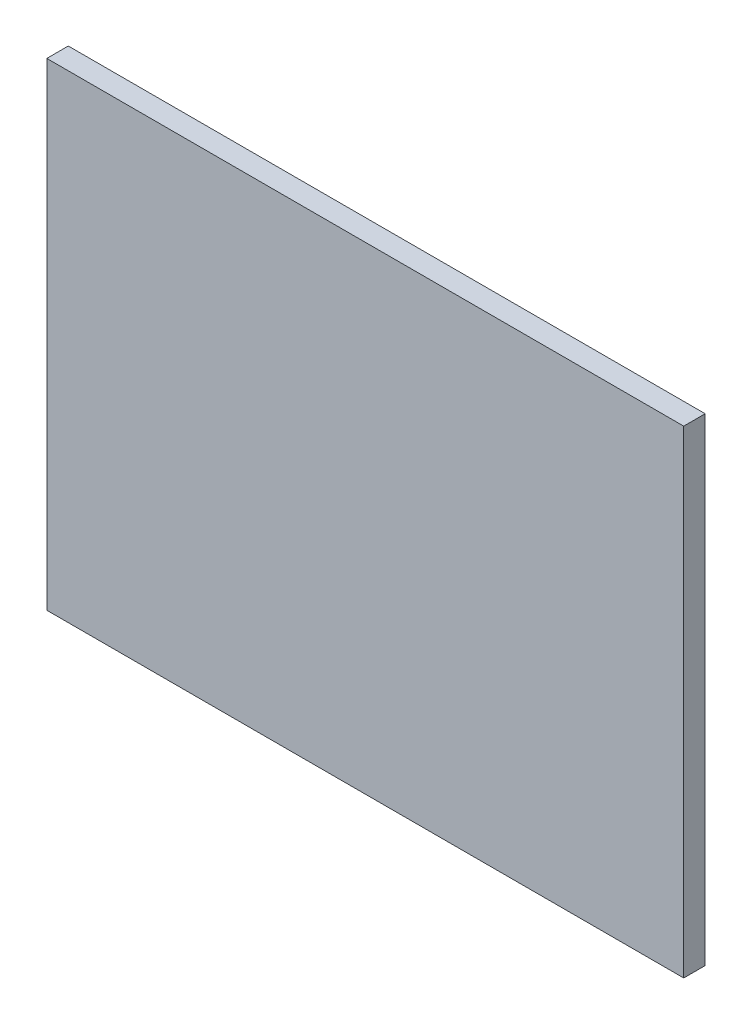
ISO-10303-21;
HEADER;
FILE_DESCRIPTION(('STEP AP214'),'2;1');
FILE_NAME('part.step','',(''),(''),'','','');
FILE_SCHEMA(('AUTOMOTIVE_DESIGN { 1 0 10303 214 1 1 1 1 }'));
ENDSEC;
DATA;
#1=APPLICATION_CONTEXT('core data for automotive mechanical design processes');
#2=APPLICATION_PROTOCOL_DEFINITION('international standard','automotive_design',2000,#1);
#3=PRODUCT_CONTEXT('',#1,'mechanical');
#4=PRODUCT('Part','Part','',(#3));
#5=PRODUCT_RELATED_PRODUCT_CATEGORY('part','',(#4));
#6=PRODUCT_DEFINITION_FORMATION('','',#4);
#7=PRODUCT_DEFINITION_CONTEXT('part definition',#1,'design');
#8=PRODUCT_DEFINITION('design','',#6,#7);
#9=PRODUCT_DEFINITION_SHAPE('','',#8);
#10=(LENGTH_UNIT() NAMED_UNIT(*) SI_UNIT(.MILLI.,.METRE.));
#11=(NAMED_UNIT(*) PLANE_ANGLE_UNIT() SI_UNIT($,.RADIAN.));
#12=(NAMED_UNIT(*) SI_UNIT($,.STERADIAN.) SOLID_ANGLE_UNIT());
#13=UNCERTAINTY_MEASURE_WITH_UNIT(LENGTH_MEASURE(1.E-05),#10,'distance_accuracy_value','');
#14=(GEOMETRIC_REPRESENTATION_CONTEXT(3) GLOBAL_UNCERTAINTY_ASSIGNED_CONTEXT((#13)) GLOBAL_UNIT_ASSIGNED_CONTEXT((#10,
#11,#12)) REPRESENTATION_CONTEXT('',''));
#15=CARTESIAN_POINT('',(0.,0.,0.));
#16=DIRECTION('',(0.,0.,1.));
#17=DIRECTION('',(1.,0.,0.));
#18=AXIS2_PLACEMENT_3D('',#15,#16,#17);
#19=CARTESIAN_POINT('',(0.,222.524852620141,10.));
#20=DIRECTION('',(1.,0.,0.));
#21=DIRECTION('',(0.,0.,-1.));
#22=AXIS2_PLACEMENT_3D('',#19,#20,#21);
#23=PLANE('',#22);
#24=DIRECTION('',(0.,-1.,0.));
#25=VECTOR('',#24,1.);
#26=CARTESIAN_POINT('',(0.,222.524852620141,0.));
#27=LINE('',#26,#25);
#28=CARTESIAN_POINT('',(0.,222.524852620141,0.));
#29=VERTEX_POINT('',#28);
#30=CARTESIAN_POINT('',(0.,0.,0.));
#31=VERTEX_POINT('',#30);
#32=EDGE_CURVE('E102',#29,#31,#27,.T.);
#33=ORIENTED_EDGE('',*,*,#32,.T.);
#34=DIRECTION('',(0.,0.,-1.));
#35=VECTOR('',#34,1.);
#36=CARTESIAN_POINT('',(0.,0.,10.));
#37=LINE('',#36,#35);
#38=CARTESIAN_POINT('',(0.,0.,10.));
#39=VERTEX_POINT('',#38);
#40=EDGE_CURVE('E11',#39,#31,#37,.T.);
#41=ORIENTED_EDGE('',*,*,#40,.F.);
#42=DIRECTION('',(0.,-1.,0.));
#43=VECTOR('',#42,1.);
#44=CARTESIAN_POINT('',(0.,222.524852620141,10.));
#45=LINE('',#44,#43);
#46=CARTESIAN_POINT('',(0.,222.524852620141,10.));
#47=VERTEX_POINT('',#46);
#48=EDGE_CURVE('E90',#47,#39,#45,.T.);
#49=ORIENTED_EDGE('',*,*,#48,.F.);
#50=DIRECTION('',(0.,0.,-1.));
#51=VECTOR('',#50,1.);
#52=CARTESIAN_POINT('',(0.,222.524852620141,10.));
#53=LINE('',#52,#51);
#54=EDGE_CURVE('E98',#47,#29,#53,.T.);
#55=ORIENTED_EDGE('',*,*,#54,.T.);
#56=EDGE_LOOP('',(#33,#41,#49,#55));
#57=FACE_BOUND('',#56,.T.);
#58=ADVANCED_FACE('F39',(#57),#23,.F.);
#59=CARTESIAN_POINT('',(0.,0.,10.));
#60=DIRECTION('',(0.,1.,0.));
#61=DIRECTION('',(0.,0.,1.));
#62=AXIS2_PLACEMENT_3D('',#59,#60,#61);
#63=PLANE('',#62);
#64=DIRECTION('',(1.,0.,0.));
#65=VECTOR('',#64,1.);
#66=CARTESIAN_POINT('',(0.,0.,0.));
#67=LINE('',#66,#65);
#68=CARTESIAN_POINT('',(296.550595169026,0.,0.));
#69=VERTEX_POINT('',#68);
#70=EDGE_CURVE('E94',#31,#69,#67,.T.);
#71=ORIENTED_EDGE('',*,*,#70,.T.);
#72=DIRECTION('',(0.,0.,-1.));
#73=VECTOR('',#72,1.);
#74=CARTESIAN_POINT('',(296.550595169026,0.,10.));
#75=LINE('',#74,#73);
#76=CARTESIAN_POINT('',(296.550595169026,0.,10.));
#77=VERTEX_POINT('',#76);
#78=EDGE_CURVE('E47',#77,#69,#75,.T.);
#79=ORIENTED_EDGE('',*,*,#78,.F.);
#80=DIRECTION('',(1.,0.,0.));
#81=VECTOR('',#80,1.);
#82=CARTESIAN_POINT('',(0.,0.,10.));
#83=LINE('',#82,#81);
#84=EDGE_CURVE('E85',#39,#77,#83,.T.);
#85=ORIENTED_EDGE('',*,*,#84,.F.);
#86=ORIENTED_EDGE('',*,*,#40,.T.);
#87=EDGE_LOOP('',(#71,#79,#85,#86));
#88=FACE_BOUND('',#87,.T.);
#89=ADVANCED_FACE('F93',(#88),#63,.F.);
#90=CARTESIAN_POINT('',(296.550595169026,222.524852620141,10.));
#91=DIRECTION('',(-1.,0.,0.));
#92=DIRECTION('',(0.,0.,1.));
#93=AXIS2_PLACEMENT_3D('',#90,#91,#92);
#94=PLANE('',#93);
#95=DIRECTION('',(0.,1.,0.));
#96=VECTOR('',#95,1.);
#97=CARTESIAN_POINT('',(296.550595169026,222.524852620141,0.));
#98=LINE('',#97,#96);
#99=CARTESIAN_POINT('',(296.550595169026,222.524852620141,0.));
#100=VERTEX_POINT('',#99);
#101=EDGE_CURVE('E72',#69,#100,#98,.T.);
#102=ORIENTED_EDGE('',*,*,#101,.T.);
#103=DIRECTION('',(0.,0.,-1.));
#104=VECTOR('',#103,1.);
#105=CARTESIAN_POINT('',(296.550595169026,222.524852620141,10.));
#106=LINE('',#105,#104);
#107=CARTESIAN_POINT('',(296.550595169026,222.524852620141,10.));
#108=VERTEX_POINT('',#107);
#109=EDGE_CURVE('E95',#108,#100,#106,.T.);
#110=ORIENTED_EDGE('',*,*,#109,.F.);
#111=DIRECTION('',(0.,1.,0.));
#112=VECTOR('',#111,1.);
#113=CARTESIAN_POINT('',(296.550595169026,222.524852620141,10.));
#114=LINE('',#113,#112);
#115=EDGE_CURVE('E88',#77,#108,#114,.T.);
#116=ORIENTED_EDGE('',*,*,#115,.F.);
#117=ORIENTED_EDGE('',*,*,#78,.T.);
#118=EDGE_LOOP('',(#102,#110,#116,#117));
#119=FACE_BOUND('',#118,.T.);
#120=ADVANCED_FACE('F96',(#119),#94,.F.);
#121=CARTESIAN_POINT('',(0.,222.524852620141,10.));
#122=DIRECTION('',(0.,-1.,0.));
#123=DIRECTION('',(0.,0.,-1.));
#124=AXIS2_PLACEMENT_3D('',#121,#122,#123);
#125=PLANE('',#124);
#126=DIRECTION('',(-1.,0.,0.));
#127=VECTOR('',#126,1.);
#128=CARTESIAN_POINT('',(0.,222.524852620141,0.));
#129=LINE('',#128,#127);
#130=EDGE_CURVE('E78',#100,#29,#129,.T.);
#131=ORIENTED_EDGE('',*,*,#130,.T.);
#132=ORIENTED_EDGE('',*,*,#54,.F.);
#133=DIRECTION('',(-1.,0.,0.));
#134=VECTOR('',#133,1.);
#135=CARTESIAN_POINT('',(0.,222.524852620141,10.));
#136=LINE('',#135,#134);
#137=EDGE_CURVE('E55',#108,#47,#136,.T.);
#138=ORIENTED_EDGE('',*,*,#137,.F.);
#139=ORIENTED_EDGE('',*,*,#109,.T.);
#140=EDGE_LOOP('',(#131,#132,#138,#139));
#141=FACE_BOUND('',#140,.T.);
#142=ADVANCED_FACE('F109',(#141),#125,.F.);
#143=CARTESIAN_POINT('',(0.,0.,10.));
#144=DIRECTION('',(0.,0.,1.));
#145=DIRECTION('',(1.,0.,0.));
#146=AXIS2_PLACEMENT_3D('',#143,#144,#145);
#147=PLANE('',#146);
#148=ORIENTED_EDGE('',*,*,#48,.T.);
#149=ORIENTED_EDGE('',*,*,#84,.T.);
#150=ORIENTED_EDGE('',*,*,#115,.T.);
#151=ORIENTED_EDGE('',*,*,#137,.T.);
#152=EDGE_LOOP('',(#148,#149,#150,#151));
#153=FACE_BOUND('',#152,.T.);
#154=ADVANCED_FACE('F86',(#153),#147,.T.);
#155=CARTESIAN_POINT('',(0.,0.,0.));
#156=DIRECTION('',(0.,0.,1.));
#157=DIRECTION('',(1.,0.,0.));
#158=AXIS2_PLACEMENT_3D('',#155,#156,#157);
#159=PLANE('',#158);
#160=ORIENTED_EDGE('',*,*,#32,.F.);
#161=ORIENTED_EDGE('',*,*,#130,.F.);
#162=ORIENTED_EDGE('',*,*,#101,.F.);
#163=ORIENTED_EDGE('',*,*,#70,.F.);
#164=EDGE_LOOP('',(#160,#161,#162,#163));
#165=FACE_BOUND('',#164,.T.);
#166=ADVANCED_FACE('F112',(#165),#159,.F.);
#167=CLOSED_SHELL('',(#58,#89,#120,#142,#154,#166));
#168=MANIFOLD_SOLID_BREP('B2',#167);
#169=ADVANCED_BREP_SHAPE_REPRESENTATION('',(#18,#168),#14);
#170=SHAPE_DEFINITION_REPRESENTATION(#9,#169);
ENDSEC;
END-ISO-10303-21;
